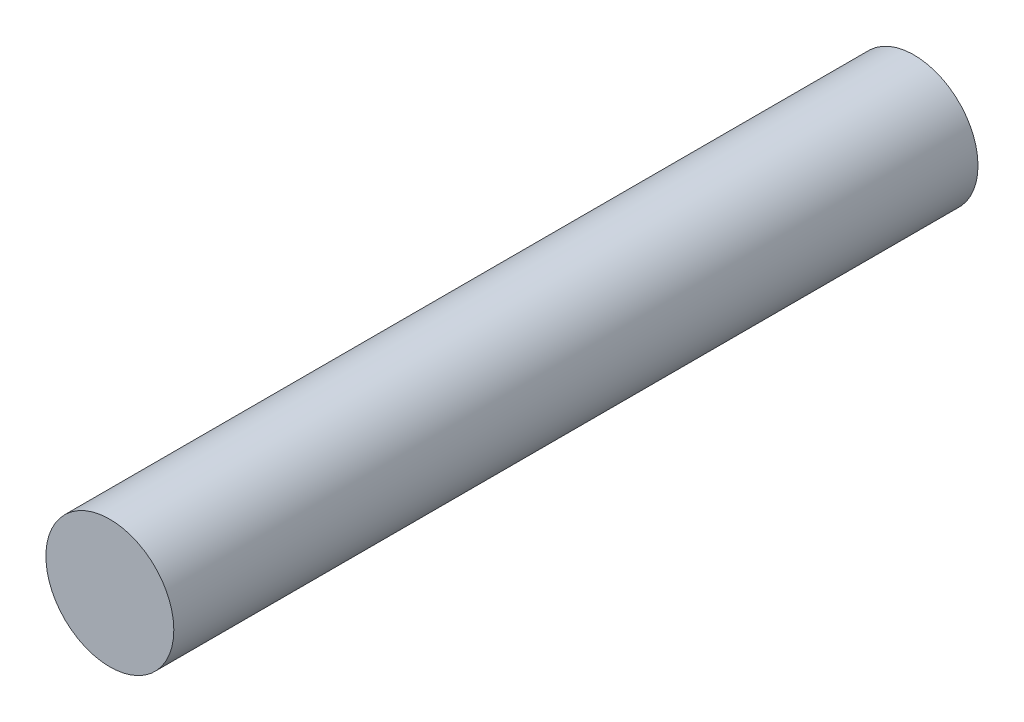
ISO-10303-21;
HEADER;
FILE_DESCRIPTION(('STEP AP214'),'2;1');
FILE_NAME('part.step','',(''),(''),'','','');
FILE_SCHEMA(('AUTOMOTIVE_DESIGN { 1 0 10303 214 1 1 1 1 }'));
ENDSEC;
DATA;
#1=APPLICATION_CONTEXT('core data for automotive mechanical design processes');
#2=APPLICATION_PROTOCOL_DEFINITION('international standard','automotive_design',2000,#1);
#3=PRODUCT_CONTEXT('',#1,'mechanical');
#4=PRODUCT('Part','Part','',(#3));
#5=PRODUCT_RELATED_PRODUCT_CATEGORY('part','',(#4));
#6=PRODUCT_DEFINITION_FORMATION('','',#4);
#7=PRODUCT_DEFINITION_CONTEXT('part definition',#1,'design');
#8=PRODUCT_DEFINITION('design','',#6,#7);
#9=PRODUCT_DEFINITION_SHAPE('','',#8);
#10=(LENGTH_UNIT() NAMED_UNIT(*) SI_UNIT(.MILLI.,.METRE.));
#11=(NAMED_UNIT(*) PLANE_ANGLE_UNIT() SI_UNIT($,.RADIAN.));
#12=(NAMED_UNIT(*) SI_UNIT($,.STERADIAN.) SOLID_ANGLE_UNIT());
#13=UNCERTAINTY_MEASURE_WITH_UNIT(LENGTH_MEASURE(1.E-05),#10,'distance_accuracy_value','');
#14=(GEOMETRIC_REPRESENTATION_CONTEXT(3) GLOBAL_UNCERTAINTY_ASSIGNED_CONTEXT((#13)) GLOBAL_UNIT_ASSIGNED_CONTEXT((#10,
#11,#12)) REPRESENTATION_CONTEXT('',''));
#15=CARTESIAN_POINT('',(0.,0.,0.));
#16=DIRECTION('',(0.,0.,1.));
#17=DIRECTION('',(1.,0.,0.));
#18=AXIS2_PLACEMENT_3D('',#15,#16,#17);
#19=CARTESIAN_POINT('',(0.,0.,22.));
#20=DIRECTION('',(0.,0.,-1.));
#21=DIRECTION('',(-1.,0.,0.));
#22=AXIS2_PLACEMENT_3D('',#19,#20,#21);
#23=CYLINDRICAL_SURFACE('',#22,1.75);
#24=CARTESIAN_POINT('',(0.,0.,22.));
#25=DIRECTION('',(0.,0.,1.));
#26=DIRECTION('',(1.,0.,0.));
#27=AXIS2_PLACEMENT_3D('',#24,#25,#26);
#28=CIRCLE('',#27,1.75);
#29=CARTESIAN_POINT('',(1.75,0.,22.));
#30=VERTEX_POINT('',#29);
#31=EDGE_CURVE('E10',#30,#30,#28,.T.);
#32=ORIENTED_EDGE('',*,*,#31,.F.);
#33=EDGE_LOOP('',(#32));
#34=FACE_BOUND('',#33,.T.);
#35=CARTESIAN_POINT('',(0.,0.,0.));
#36=DIRECTION('',(0.,0.,1.));
#37=DIRECTION('',(1.,0.,0.));
#38=AXIS2_PLACEMENT_3D('',#35,#36,#37);
#39=CIRCLE('',#38,1.75);
#40=CARTESIAN_POINT('',(1.75,0.,0.));
#41=VERTEX_POINT('',#40);
#42=EDGE_CURVE('E36',#41,#41,#39,.T.);
#43=ORIENTED_EDGE('',*,*,#42,.T.);
#44=EDGE_LOOP('',(#43));
#45=FACE_BOUND('',#44,.T.);
#46=ADVANCED_FACE('F33',(#34,#45),#23,.T.);
#47=CARTESIAN_POINT('',(0.,0.,22.));
#48=DIRECTION('',(0.,0.,1.));
#49=DIRECTION('',(1.,0.,0.));
#50=AXIS2_PLACEMENT_3D('',#47,#48,#49);
#51=PLANE('',#50);
#52=ORIENTED_EDGE('',*,*,#31,.T.);
#53=EDGE_LOOP('',(#52));
#54=FACE_BOUND('',#53,.T.);
#55=ADVANCED_FACE('F48',(#54),#51,.T.);
#56=CARTESIAN_POINT('',(0.,0.,0.));
#57=DIRECTION('',(0.,0.,1.));
#58=DIRECTION('',(1.,0.,0.));
#59=AXIS2_PLACEMENT_3D('',#56,#57,#58);
#60=PLANE('',#59);
#61=ORIENTED_EDGE('',*,*,#42,.F.);
#62=EDGE_LOOP('',(#61));
#63=FACE_BOUND('',#62,.T.);
#64=ADVANCED_FACE('F46',(#63),#60,.F.);
#65=CLOSED_SHELL('',(#46,#55,#64));
#66=MANIFOLD_SOLID_BREP('B2',#65);
#67=ADVANCED_BREP_SHAPE_REPRESENTATION('',(#18,#66),#14);
#68=SHAPE_DEFINITION_REPRESENTATION(#9,#67);
ENDSEC;
END-ISO-10303-21;
